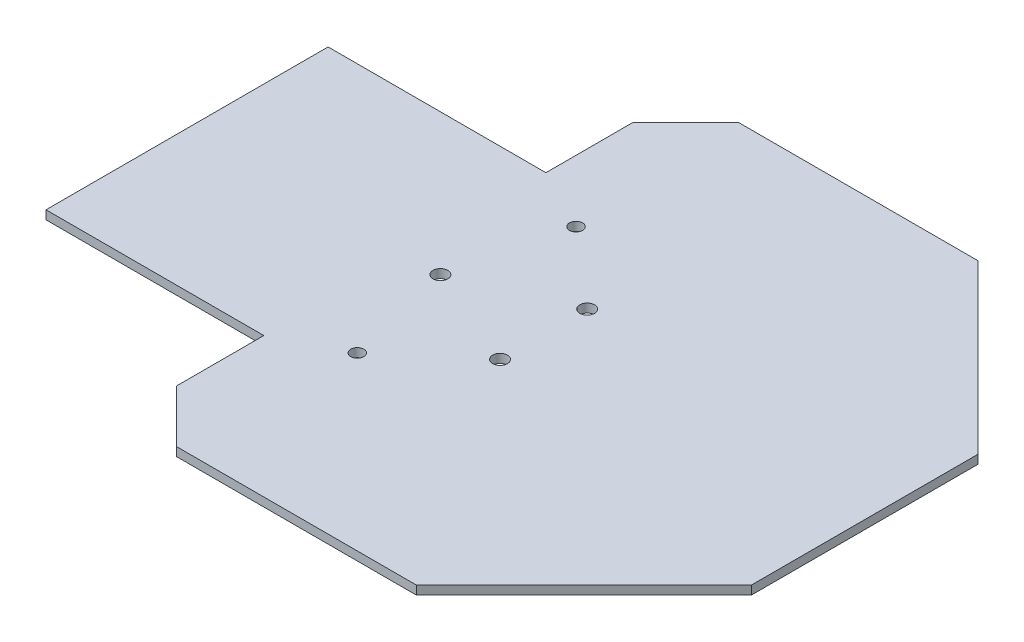
ISO-10303-21;
HEADER;
FILE_DESCRIPTION(('STEP AP214'),'2;1');
FILE_NAME('part.step','',(''),(''),'','','');
FILE_SCHEMA(('AUTOMOTIVE_DESIGN { 1 0 10303 214 1 1 1 1 }'));
ENDSEC;
DATA;
#1=APPLICATION_CONTEXT('core data for automotive mechanical design processes');
#2=APPLICATION_PROTOCOL_DEFINITION('international standard','automotive_design',2000,#1);
#3=PRODUCT_CONTEXT('',#1,'mechanical');
#4=PRODUCT('Part','Part','',(#3));
#5=PRODUCT_RELATED_PRODUCT_CATEGORY('part','',(#4));
#6=PRODUCT_DEFINITION_FORMATION('','',#4);
#7=PRODUCT_DEFINITION_CONTEXT('part definition',#1,'design');
#8=PRODUCT_DEFINITION('design','',#6,#7);
#9=PRODUCT_DEFINITION_SHAPE('','',#8);
#10=(LENGTH_UNIT() NAMED_UNIT(*) SI_UNIT(.MILLI.,.METRE.));
#11=(NAMED_UNIT(*) PLANE_ANGLE_UNIT() SI_UNIT($,.RADIAN.));
#12=(NAMED_UNIT(*) SI_UNIT($,.STERADIAN.) SOLID_ANGLE_UNIT());
#13=UNCERTAINTY_MEASURE_WITH_UNIT(LENGTH_MEASURE(1.E-05),#10,'distance_accuracy_value','');
#14=(GEOMETRIC_REPRESENTATION_CONTEXT(3) GLOBAL_UNCERTAINTY_ASSIGNED_CONTEXT((#13)) GLOBAL_UNIT_ASSIGNED_CONTEXT((#10,
#11,#12)) REPRESENTATION_CONTEXT('',''));
#15=CARTESIAN_POINT('',(0.,0.,0.));
#16=DIRECTION('',(0.,0.,1.));
#17=DIRECTION('',(1.,0.,0.));
#18=AXIS2_PLACEMENT_3D('',#15,#16,#17);
#19=CARTESIAN_POINT('',(0.,2.,-12.09));
#20=DIRECTION('',(1.,0.,0.));
#21=DIRECTION('',(0.,0.,-1.));
#22=AXIS2_PLACEMENT_3D('',#19,#20,#21);
#23=PLANE('',#22);
#24=DIRECTION('',(0.,-1.,0.));
#25=VECTOR('',#24,1.);
#26=CARTESIAN_POINT('',(0.,2.,-96.84));
#27=LINE('',#26,#25);
#28=CARTESIAN_POINT('',(0.,2.,-96.84));
#29=VERTEX_POINT('',#28);
#30=CARTESIAN_POINT('',(0.,0.,-96.84));
#31=VERTEX_POINT('',#30);
#32=EDGE_CURVE('E63',#29,#31,#27,.T.);
#33=ORIENTED_EDGE('',*,*,#32,.F.);
#34=DIRECTION('',(0.,0.,1.));
#35=VECTOR('',#34,1.);
#36=CARTESIAN_POINT('',(0.,2.,-12.09));
#37=LINE('',#36,#35);
#38=CARTESIAN_POINT('',(0.,2.,-116.84));
#39=VERTEX_POINT('',#38);
#40=EDGE_CURVE('E223',#39,#29,#37,.T.);
#41=ORIENTED_EDGE('',*,*,#40,.F.);
#42=DIRECTION('',(0.,-1.,0.));
#43=VECTOR('',#42,1.);
#44=CARTESIAN_POINT('',(0.,2.,-116.84));
#45=LINE('',#44,#43);
#46=CARTESIAN_POINT('',(0.,0.,-116.84));
#47=VERTEX_POINT('',#46);
#48=EDGE_CURVE('E282',#39,#47,#45,.T.);
#49=ORIENTED_EDGE('',*,*,#48,.T.);
#50=DIRECTION('',(0.,0.,1.));
#51=VECTOR('',#50,1.);
#52=CARTESIAN_POINT('',(0.,0.,-12.09));
#53=LINE('',#52,#51);
#54=EDGE_CURVE('E249',#47,#31,#53,.T.);
#55=ORIENTED_EDGE('',*,*,#54,.T.);
#56=EDGE_LOOP('',(#33,#41,#49,#55));
#57=FACE_BOUND('',#56,.T.);
#58=ADVANCED_FACE('F47',(#57),#23,.F.);
#59=DIRECTION('',(0.,1.,0.));
#60=VECTOR('',#59,1.);
#61=CARTESIAN_POINT('',(0.,2.,-32.09));
#62=LINE('',#61,#60);
#63=CARTESIAN_POINT('',(0.,0.,-32.09));
#64=VERTEX_POINT('',#63);
#65=CARTESIAN_POINT('',(0.,2.,-32.09));
#66=VERTEX_POINT('',#65);
#67=EDGE_CURVE('E71',#64,#66,#62,.T.);
#68=ORIENTED_EDGE('',*,*,#67,.F.);
#69=CARTESIAN_POINT('',(0.,0.,-12.09));
#70=VERTEX_POINT('',#69);
#71=EDGE_CURVE('E248',#64,#70,#53,.T.);
#72=ORIENTED_EDGE('',*,*,#71,.T.);
#73=DIRECTION('',(0.,-1.,0.));
#74=VECTOR('',#73,1.);
#75=CARTESIAN_POINT('',(0.,2.,-12.09));
#76=LINE('',#75,#74);
#77=CARTESIAN_POINT('',(0.,2.,-12.09));
#78=VERTEX_POINT('',#77);
#79=EDGE_CURVE('E278',#78,#70,#76,.T.);
#80=ORIENTED_EDGE('',*,*,#79,.F.);
#81=EDGE_CURVE('E222',#66,#78,#37,.T.);
#82=ORIENTED_EDGE('',*,*,#81,.F.);
#83=EDGE_LOOP('',(#68,#72,#80,#82));
#84=FACE_BOUND('',#83,.T.);
#85=ADVANCED_FACE('F316',(#84),#23,.F.);
#86=CARTESIAN_POINT('',(67.09,2.,-128.93));
#87=DIRECTION('',(-0.707152737497725,0.,0.707060821888381));
#88=DIRECTION('',(0.707060821888381,0.,0.707152737497725));
#89=AXIS2_PLACEMENT_3D('',#86,#87,#88);
#90=PLANE('',#89);
#91=DIRECTION('',(-0.707060821888381,0.,-0.707152737497725));
#92=VECTOR('',#91,1.);
#93=CARTESIAN_POINT('',(67.09,0.,-128.93));
#94=LINE('',#93,#92);
#95=CARTESIAN_POINT('',(105.554999675029,0.,-90.46));
#96=VERTEX_POINT('',#95);
#97=CARTESIAN_POINT('',(67.09,0.,-128.93));
#98=VERTEX_POINT('',#97);
#99=EDGE_CURVE('E191',#96,#98,#94,.T.);
#100=ORIENTED_EDGE('',*,*,#99,.T.);
#101=DIRECTION('',(0.,-1.,0.));
#102=VECTOR('',#101,1.);
#103=CARTESIAN_POINT('',(67.09,2.,-128.93));
#104=LINE('',#103,#102);
#105=CARTESIAN_POINT('',(67.09,2.,-128.93));
#106=VERTEX_POINT('',#105);
#107=EDGE_CURVE('E11',#106,#98,#104,.T.);
#108=ORIENTED_EDGE('',*,*,#107,.F.);
#109=DIRECTION('',(-0.707060821888381,0.,-0.707152737497725));
#110=VECTOR('',#109,1.);
#111=CARTESIAN_POINT('',(67.09,2.,-128.93));
#112=LINE('',#111,#110);
#113=CARTESIAN_POINT('',(105.554999675029,2.,-90.46));
#114=VERTEX_POINT('',#113);
#115=EDGE_CURVE('E211',#114,#106,#112,.T.);
#116=ORIENTED_EDGE('',*,*,#115,.F.);
#117=DIRECTION('',(0.,-1.,0.));
#118=VECTOR('',#117,1.);
#119=CARTESIAN_POINT('',(105.554999675029,2.,-90.46));
#120=LINE('',#119,#118);
#121=EDGE_CURVE('E238',#114,#96,#120,.T.);
#122=ORIENTED_EDGE('',*,*,#121,.T.);
#123=EDGE_LOOP('',(#100,#108,#116,#122));
#124=FACE_BOUND('',#123,.T.);
#125=ADVANCED_FACE('F49',(#124),#90,.F.);
#126=CARTESIAN_POINT('',(12.09,2.,-128.93));
#127=DIRECTION('',(0.,0.,1.));
#128=DIRECTION('',(1.,0.,0.));
#129=AXIS2_PLACEMENT_3D('',#126,#127,#128);
#130=PLANE('',#129);
#131=DIRECTION('',(-1.,0.,0.));
#132=VECTOR('',#131,1.);
#133=CARTESIAN_POINT('',(12.09,0.,-128.93));
#134=LINE('',#133,#132);
#135=CARTESIAN_POINT('',(12.09,0.,-128.93));
#136=VERTEX_POINT('',#135);
#137=EDGE_CURVE('E242',#98,#136,#134,.T.);
#138=ORIENTED_EDGE('',*,*,#137,.T.);
#139=DIRECTION('',(0.,-1.,0.));
#140=VECTOR('',#139,1.);
#141=CARTESIAN_POINT('',(12.09,2.,-128.93));
#142=LINE('',#141,#140);
#143=CARTESIAN_POINT('',(12.09,2.,-128.93));
#144=VERTEX_POINT('',#143);
#145=EDGE_CURVE('E56',#144,#136,#142,.T.);
#146=ORIENTED_EDGE('',*,*,#145,.F.);
#147=DIRECTION('',(-1.,0.,0.));
#148=VECTOR('',#147,1.);
#149=CARTESIAN_POINT('',(12.09,2.,-128.93));
#150=LINE('',#149,#148);
#151=EDGE_CURVE('E215',#106,#144,#150,.T.);
#152=ORIENTED_EDGE('',*,*,#151,.F.);
#153=ORIENTED_EDGE('',*,*,#107,.T.);
#154=EDGE_LOOP('',(#138,#146,#152,#153));
#155=FACE_BOUND('',#154,.T.);
#156=ADVANCED_FACE('F338',(#155),#130,.F.);
#157=CARTESIAN_POINT('',(0.,2.,-116.84));
#158=DIRECTION('',(0.707106781186548,0.,0.707106781186547));
#159=DIRECTION('',(0.707106781186547,0.,-0.707106781186548));
#160=AXIS2_PLACEMENT_3D('',#157,#158,#159);
#161=PLANE('',#160);
#162=DIRECTION('',(-0.707106781186547,0.,0.707106781186548));
#163=VECTOR('',#162,1.);
#164=CARTESIAN_POINT('',(0.,0.,-116.84));
#165=LINE('',#164,#163);
#166=EDGE_CURVE('E245',#136,#47,#165,.T.);
#167=ORIENTED_EDGE('',*,*,#166,.T.);
#168=ORIENTED_EDGE('',*,*,#48,.F.);
#169=DIRECTION('',(-0.707106781186547,0.,0.707106781186548));
#170=VECTOR('',#169,1.);
#171=CARTESIAN_POINT('',(0.,2.,-116.84));
#172=LINE('',#171,#170);
#173=EDGE_CURVE('E219',#144,#39,#172,.T.);
#174=ORIENTED_EDGE('',*,*,#173,.F.);
#175=ORIENTED_EDGE('',*,*,#145,.T.);
#176=EDGE_LOOP('',(#167,#168,#174,#175));
#177=FACE_BOUND('',#176,.T.);
#178=ADVANCED_FACE('F291',(#177),#161,.F.);
#179=CARTESIAN_POINT('',(12.09,2.,0.));
#180=DIRECTION('',(0.707106781186547,0.,-0.707106781186547));
#181=DIRECTION('',(-0.707106781186548,0.,-0.707106781186548));
#182=AXIS2_PLACEMENT_3D('',#179,#180,#181);
#183=PLANE('',#182);
#184=DIRECTION('',(0.707106781186547,0.,0.707106781186547));
#185=VECTOR('',#184,1.);
#186=CARTESIAN_POINT('',(12.09,0.,0.));
#187=LINE('',#186,#185);
#188=CARTESIAN_POINT('',(12.09,0.,0.));
#189=VERTEX_POINT('',#188);
#190=EDGE_CURVE('E252',#70,#189,#187,.T.);
#191=ORIENTED_EDGE('',*,*,#190,.T.);
#192=DIRECTION('',(0.,-1.,0.));
#193=VECTOR('',#192,1.);
#194=CARTESIAN_POINT('',(12.09,2.,0.));
#195=LINE('',#194,#193);
#196=CARTESIAN_POINT('',(12.09,2.,0.));
#197=VERTEX_POINT('',#196);
#198=EDGE_CURVE('E274',#197,#189,#195,.T.);
#199=ORIENTED_EDGE('',*,*,#198,.F.);
#200=DIRECTION('',(0.707106781186547,0.,0.707106781186547));
#201=VECTOR('',#200,1.);
#202=CARTESIAN_POINT('',(12.09,2.,0.));
#203=LINE('',#202,#201);
#204=EDGE_CURVE('E226',#78,#197,#203,.T.);
#205=ORIENTED_EDGE('',*,*,#204,.F.);
#206=ORIENTED_EDGE('',*,*,#79,.T.);
#207=EDGE_LOOP('',(#191,#199,#205,#206));
#208=FACE_BOUND('',#207,.T.);
#209=ADVANCED_FACE('F319',(#208),#183,.F.);
#210=CARTESIAN_POINT('',(67.09,2.,0.));
#211=DIRECTION('',(0.,0.,-1.));
#212=DIRECTION('',(-1.,0.,0.));
#213=AXIS2_PLACEMENT_3D('',#210,#211,#212);
#214=PLANE('',#213);
#215=DIRECTION('',(1.,0.,0.));
#216=VECTOR('',#215,1.);
#217=CARTESIAN_POINT('',(67.09,0.,0.));
#218=LINE('',#217,#216);
#219=CARTESIAN_POINT('',(67.09,0.,0.));
#220=VERTEX_POINT('',#219);
#221=EDGE_CURVE('E255',#189,#220,#218,.T.);
#222=ORIENTED_EDGE('',*,*,#221,.T.);
#223=DIRECTION('',(0.,-1.,0.));
#224=VECTOR('',#223,1.);
#225=CARTESIAN_POINT('',(67.09,2.,0.));
#226=LINE('',#225,#224);
#227=CARTESIAN_POINT('',(67.09,2.,0.));
#228=VERTEX_POINT('',#227);
#229=EDGE_CURVE('E270',#228,#220,#226,.T.);
#230=ORIENTED_EDGE('',*,*,#229,.F.);
#231=DIRECTION('',(1.,0.,0.));
#232=VECTOR('',#231,1.);
#233=CARTESIAN_POINT('',(67.09,2.,0.));
#234=LINE('',#233,#232);
#235=EDGE_CURVE('E229',#197,#228,#234,.T.);
#236=ORIENTED_EDGE('',*,*,#235,.F.);
#237=ORIENTED_EDGE('',*,*,#198,.T.);
#238=EDGE_LOOP('',(#222,#230,#236,#237));
#239=FACE_BOUND('',#238,.T.);
#240=ADVANCED_FACE('F324',(#239),#214,.F.);
#241=CARTESIAN_POINT('',(105.554999675029,2.,-38.46));
#242=DIRECTION('',(-0.707060821888382,0.,-0.707152737497725));
#243=DIRECTION('',(-0.707152737497725,0.,0.707060821888382));
#244=AXIS2_PLACEMENT_3D('',#241,#242,#243);
#245=PLANE('',#244);
#246=DIRECTION('',(0.707152737497725,0.,-0.707060821888382));
#247=VECTOR('',#246,1.);
#248=CARTESIAN_POINT('',(105.554999675029,0.,-38.46));
#249=LINE('',#248,#247);
#250=CARTESIAN_POINT('',(105.554999675029,0.,-38.46));
#251=VERTEX_POINT('',#250);
#252=EDGE_CURVE('E258',#220,#251,#249,.T.);
#253=ORIENTED_EDGE('',*,*,#252,.T.);
#254=DIRECTION('',(0.,-1.,0.));
#255=VECTOR('',#254,1.);
#256=CARTESIAN_POINT('',(105.554999675029,2.,-38.46));
#257=LINE('',#256,#255);
#258=CARTESIAN_POINT('',(105.554999675029,2.,-38.46));
#259=VERTEX_POINT('',#258);
#260=EDGE_CURVE('E266',#259,#251,#257,.T.);
#261=ORIENTED_EDGE('',*,*,#260,.F.);
#262=DIRECTION('',(0.707152737497725,0.,-0.707060821888382));
#263=VECTOR('',#262,1.);
#264=CARTESIAN_POINT('',(105.554999675029,2.,-38.46));
#265=LINE('',#264,#263);
#266=EDGE_CURVE('E232',#228,#259,#265,.T.);
#267=ORIENTED_EDGE('',*,*,#266,.F.);
#268=ORIENTED_EDGE('',*,*,#229,.T.);
#269=EDGE_LOOP('',(#253,#261,#267,#268));
#270=FACE_BOUND('',#269,.T.);
#271=ADVANCED_FACE('F330',(#270),#245,.F.);
#272=CARTESIAN_POINT('',(105.554999675029,2.,-90.46));
#273=DIRECTION('',(-1.,0.,0.));
#274=DIRECTION('',(0.,0.,1.));
#275=AXIS2_PLACEMENT_3D('',#272,#273,#274);
#276=PLANE('',#275);
#277=DIRECTION('',(0.,0.,-1.));
#278=VECTOR('',#277,1.);
#279=CARTESIAN_POINT('',(105.554999675029,0.,-90.46));
#280=LINE('',#279,#278);
#281=EDGE_CURVE('E216',#251,#96,#280,.T.);
#282=ORIENTED_EDGE('',*,*,#281,.T.);
#283=ORIENTED_EDGE('',*,*,#121,.F.);
#284=DIRECTION('',(0.,0.,-1.));
#285=VECTOR('',#284,1.);
#286=CARTESIAN_POINT('',(105.554999675029,2.,-90.46));
#287=LINE('',#286,#285);
#288=EDGE_CURVE('E235',#259,#114,#287,.T.);
#289=ORIENTED_EDGE('',*,*,#288,.F.);
#290=ORIENTED_EDGE('',*,*,#260,.T.);
#291=EDGE_LOOP('',(#282,#283,#289,#290));
#292=FACE_BOUND('',#291,.T.);
#293=ADVANCED_FACE('F334',(#292),#276,.F.);
#294=CARTESIAN_POINT('',(0.,2.,0.));
#295=DIRECTION('',(0.,-1.,0.));
#296=DIRECTION('',(0.,0.,-1.));
#297=AXIS2_PLACEMENT_3D('',#294,#295,#296);
#298=PLANE('',#297);
#299=CARTESIAN_POINT('',(14.18,2.,-89.57));
#300=DIRECTION('',(0.,1.,0.));
#301=DIRECTION('',(0.,0.,1.));
#302=AXIS2_PLACEMENT_3D('',#299,#300,#301);
#303=CIRCLE('',#302,1.5);
#304=CARTESIAN_POINT('',(14.18,2.,-88.07));
#305=VERTEX_POINT('',#304);
#306=EDGE_CURVE('E175',#305,#305,#303,.T.);
#307=ORIENTED_EDGE('',*,*,#306,.F.);
#308=EDGE_LOOP('',(#307));
#309=FACE_BOUND('',#308,.T.);
#310=CARTESIAN_POINT('',(14.1776215554253,2.,-39.3586567371682));
#311=DIRECTION('',(0.,1.,0.));
#312=DIRECTION('',(0.,0.,-1.));
#313=AXIS2_PLACEMENT_3D('',#310,#311,#312);
#314=CIRCLE('',#313,1.49999999999998);
#315=CARTESIAN_POINT('',(14.1776215554253,2.,-40.8586567371681));
#316=VERTEX_POINT('',#315);
#317=EDGE_CURVE('E164',#316,#316,#314,.T.);
#318=ORIENTED_EDGE('',*,*,#317,.F.);
#319=EDGE_LOOP('',(#318));
#320=FACE_BOUND('',#319,.T.);
#321=CARTESIAN_POINT('',(8.15000000000004,2.,-64.465));
#322=DIRECTION('',(0.,1.,0.));
#323=DIRECTION('',(0.,0.,1.));
#324=AXIS2_PLACEMENT_3D('',#321,#322,#323);
#325=CIRCLE('',#324,1.69999999999999);
#326=CARTESIAN_POINT('',(8.15000000000004,2.,-62.765));
#327=VERTEX_POINT('',#326);
#328=EDGE_CURVE('E192',#327,#327,#325,.T.);
#329=ORIENTED_EDGE('',*,*,#328,.F.);
#330=EDGE_LOOP('',(#329));
#331=FACE_BOUND('',#330,.T.);
#332=CARTESIAN_POINT('',(31.85,2.,-54.465));
#333=DIRECTION('',(0.,1.,0.));
#334=DIRECTION('',(0.,0.,1.));
#335=AXIS2_PLACEMENT_3D('',#332,#333,#334);
#336=CIRCLE('',#335,1.7);
#337=CARTESIAN_POINT('',(31.85,2.,-52.765));
#338=VERTEX_POINT('',#337);
#339=EDGE_CURVE('E196',#338,#338,#336,.T.);
#340=ORIENTED_EDGE('',*,*,#339,.F.);
#341=EDGE_LOOP('',(#340));
#342=FACE_BOUND('',#341,.T.);
#343=CARTESIAN_POINT('',(31.85,2.,-74.465));
#344=DIRECTION('',(0.,1.,0.));
#345=DIRECTION('',(0.,0.,1.));
#346=AXIS2_PLACEMENT_3D('',#343,#344,#345);
#347=CIRCLE('',#346,1.69999999999999);
#348=CARTESIAN_POINT('',(31.85,2.,-72.765));
#349=VERTEX_POINT('',#348);
#350=EDGE_CURVE('E204',#349,#349,#347,.T.);
#351=ORIENTED_EDGE('',*,*,#350,.F.);
#352=EDGE_LOOP('',(#351));
#353=FACE_BOUND('',#352,.T.);
#354=ORIENTED_EDGE('',*,*,#115,.T.);
#355=ORIENTED_EDGE('',*,*,#151,.T.);
#356=ORIENTED_EDGE('',*,*,#173,.T.);
#357=ORIENTED_EDGE('',*,*,#40,.T.);
#358=DIRECTION('',(1.,0.,0.));
#359=VECTOR('',#358,1.);
#360=CARTESIAN_POINT('',(-50.,2.,-96.84));
#361=LINE('',#360,#359);
#362=CARTESIAN_POINT('',(-50.,2.,-96.84));
#363=VERTEX_POINT('',#362);
#364=EDGE_CURVE('E296',#363,#29,#361,.T.);
#365=ORIENTED_EDGE('',*,*,#364,.F.);
#366=DIRECTION('',(0.,0.,-1.));
#367=VECTOR('',#366,1.);
#368=CARTESIAN_POINT('',(-50.,2.,-96.84));
#369=LINE('',#368,#367);
#370=CARTESIAN_POINT('',(-50.,2.,-32.09));
#371=VERTEX_POINT('',#370);
#372=EDGE_CURVE('E156',#371,#363,#369,.T.);
#373=ORIENTED_EDGE('',*,*,#372,.F.);
#374=DIRECTION('',(1.,0.,0.));
#375=VECTOR('',#374,1.);
#376=CARTESIAN_POINT('',(-50.,2.,-32.09));
#377=LINE('',#376,#375);
#378=EDGE_CURVE('E171',#371,#66,#377,.T.);
#379=ORIENTED_EDGE('',*,*,#378,.T.);
#380=ORIENTED_EDGE('',*,*,#81,.T.);
#381=ORIENTED_EDGE('',*,*,#204,.T.);
#382=ORIENTED_EDGE('',*,*,#235,.T.);
#383=ORIENTED_EDGE('',*,*,#266,.T.);
#384=ORIENTED_EDGE('',*,*,#288,.T.);
#385=EDGE_LOOP('',(#354,#355,#356,#357,#365,#373,#379,#380,#381,#382,#383,#384));
#386=FACE_BOUND('',#385,.T.);
#387=ADVANCED_FACE('F295',(#309,#320,#331,#342,#353,#386),#298,.F.);
#388=CARTESIAN_POINT('',(0.,0.,0.));
#389=DIRECTION('',(0.,-1.,0.));
#390=DIRECTION('',(0.,0.,-1.));
#391=AXIS2_PLACEMENT_3D('',#388,#389,#390);
#392=PLANE('',#391);
#393=CARTESIAN_POINT('',(14.18,0.,-89.57));
#394=DIRECTION('',(0.,-1.,0.));
#395=DIRECTION('',(0.,0.,-1.));
#396=AXIS2_PLACEMENT_3D('',#393,#394,#395);
#397=CIRCLE('',#396,1.5);
#398=CARTESIAN_POINT('',(14.18,0.,-91.07));
#399=VERTEX_POINT('',#398);
#400=EDGE_CURVE('E180',#399,#399,#397,.F.);
#401=ORIENTED_EDGE('',*,*,#400,.T.);
#402=EDGE_LOOP('',(#401));
#403=FACE_BOUND('',#402,.T.);
#404=CARTESIAN_POINT('',(14.1776215554253,0.,-39.3586567371682));
#405=DIRECTION('',(0.,-1.,0.));
#406=DIRECTION('',(0.,0.,-1.));
#407=AXIS2_PLACEMENT_3D('',#404,#405,#406);
#408=CIRCLE('',#407,1.49999999999998);
#409=CARTESIAN_POINT('',(14.1776215554253,0.,-40.8586567371681));
#410=VERTEX_POINT('',#409);
#411=EDGE_CURVE('E169',#410,#410,#408,.F.);
#412=ORIENTED_EDGE('',*,*,#411,.T.);
#413=EDGE_LOOP('',(#412));
#414=FACE_BOUND('',#413,.T.);
#415=CARTESIAN_POINT('',(8.15000000000004,0.,-64.465));
#416=DIRECTION('',(0.,1.,0.));
#417=DIRECTION('',(0.,0.,1.));
#418=AXIS2_PLACEMENT_3D('',#415,#416,#417);
#419=CIRCLE('',#418,1.69999999999999);
#420=CARTESIAN_POINT('',(8.15000000000004,0.,-62.765));
#421=VERTEX_POINT('',#420);
#422=EDGE_CURVE('E187',#421,#421,#419,.T.);
#423=ORIENTED_EDGE('',*,*,#422,.T.);
#424=EDGE_LOOP('',(#423));
#425=FACE_BOUND('',#424,.T.);
#426=CARTESIAN_POINT('',(31.85,0.,-54.465));
#427=DIRECTION('',(0.,1.,0.));
#428=DIRECTION('',(0.,0.,1.));
#429=AXIS2_PLACEMENT_3D('',#426,#427,#428);
#430=CIRCLE('',#429,1.7);
#431=CARTESIAN_POINT('',(31.85,0.,-52.765));
#432=VERTEX_POINT('',#431);
#433=EDGE_CURVE('E200',#432,#432,#430,.T.);
#434=ORIENTED_EDGE('',*,*,#433,.T.);
#435=EDGE_LOOP('',(#434));
#436=FACE_BOUND('',#435,.T.);
#437=CARTESIAN_POINT('',(31.85,0.,-74.465));
#438=DIRECTION('',(0.,1.,0.));
#439=DIRECTION('',(0.,0.,1.));
#440=AXIS2_PLACEMENT_3D('',#437,#438,#439);
#441=CIRCLE('',#440,1.69999999999999);
#442=CARTESIAN_POINT('',(31.85,0.,-72.765));
#443=VERTEX_POINT('',#442);
#444=EDGE_CURVE('E179',#443,#443,#441,.T.);
#445=ORIENTED_EDGE('',*,*,#444,.T.);
#446=EDGE_LOOP('',(#445));
#447=FACE_BOUND('',#446,.T.);
#448=ORIENTED_EDGE('',*,*,#99,.F.);
#449=ORIENTED_EDGE('',*,*,#281,.F.);
#450=ORIENTED_EDGE('',*,*,#252,.F.);
#451=ORIENTED_EDGE('',*,*,#221,.F.);
#452=ORIENTED_EDGE('',*,*,#190,.F.);
#453=ORIENTED_EDGE('',*,*,#71,.F.);
#454=DIRECTION('',(1.,0.,0.));
#455=VECTOR('',#454,1.);
#456=CARTESIAN_POINT('',(-50.,0.,-32.09));
#457=LINE('',#456,#455);
#458=CARTESIAN_POINT('',(-50.,0.,-32.09));
#459=VERTEX_POINT('',#458);
#460=EDGE_CURVE('E146',#459,#64,#457,.T.);
#461=ORIENTED_EDGE('',*,*,#460,.F.);
#462=DIRECTION('',(0.,0.,1.));
#463=VECTOR('',#462,1.);
#464=CARTESIAN_POINT('',(-50.,0.,-96.84));
#465=LINE('',#464,#463);
#466=CARTESIAN_POINT('',(-50.,0.,-96.84));
#467=VERTEX_POINT('',#466);
#468=EDGE_CURVE('E138',#467,#459,#465,.T.);
#469=ORIENTED_EDGE('',*,*,#468,.F.);
#470=DIRECTION('',(1.,0.,0.));
#471=VECTOR('',#470,1.);
#472=CARTESIAN_POINT('',(-50.,0.,-96.84));
#473=LINE('',#472,#471);
#474=EDGE_CURVE('E144',#467,#31,#473,.T.);
#475=ORIENTED_EDGE('',*,*,#474,.T.);
#476=ORIENTED_EDGE('',*,*,#54,.F.);
#477=ORIENTED_EDGE('',*,*,#166,.F.);
#478=ORIENTED_EDGE('',*,*,#137,.F.);
#479=EDGE_LOOP('',(#448,#449,#450,#451,#452,#453,#461,#469,#475,#476,#477,#478));
#480=FACE_BOUND('',#479,.T.);
#481=ADVANCED_FACE('F141',(#403,#414,#425,#436,#447,#480),#392,.T.);
#482=CARTESIAN_POINT('',(31.85,0.,-74.465));
#483=DIRECTION('',(0.,1.,0.));
#484=DIRECTION('',(0.,0.,1.));
#485=AXIS2_PLACEMENT_3D('',#482,#483,#484);
#486=CYLINDRICAL_SURFACE('',#485,1.69999999999999);
#487=ORIENTED_EDGE('',*,*,#444,.F.);
#488=EDGE_LOOP('',(#487));
#489=FACE_BOUND('',#488,.T.);
#490=ORIENTED_EDGE('',*,*,#350,.T.);
#491=EDGE_LOOP('',(#490));
#492=FACE_BOUND('',#491,.T.);
#493=ADVANCED_FACE('F363',(#489,#492),#486,.F.);
#494=CARTESIAN_POINT('',(31.85,0.,-54.465));
#495=DIRECTION('',(0.,1.,0.));
#496=DIRECTION('',(0.,0.,1.));
#497=AXIS2_PLACEMENT_3D('',#494,#495,#496);
#498=CYLINDRICAL_SURFACE('',#497,1.7);
#499=ORIENTED_EDGE('',*,*,#433,.F.);
#500=EDGE_LOOP('',(#499));
#501=FACE_BOUND('',#500,.T.);
#502=ORIENTED_EDGE('',*,*,#339,.T.);
#503=EDGE_LOOP('',(#502));
#504=FACE_BOUND('',#503,.T.);
#505=ADVANCED_FACE('F370',(#501,#504),#498,.F.);
#506=CARTESIAN_POINT('',(8.15000000000004,0.,-64.465));
#507=DIRECTION('',(0.,1.,0.));
#508=DIRECTION('',(0.,0.,1.));
#509=AXIS2_PLACEMENT_3D('',#506,#507,#508);
#510=CYLINDRICAL_SURFACE('',#509,1.69999999999999);
#511=ORIENTED_EDGE('',*,*,#422,.F.);
#512=EDGE_LOOP('',(#511));
#513=FACE_BOUND('',#512,.T.);
#514=ORIENTED_EDGE('',*,*,#328,.T.);
#515=EDGE_LOOP('',(#514));
#516=FACE_BOUND('',#515,.T.);
#517=ADVANCED_FACE('F374',(#513,#516),#510,.F.);
#518=CARTESIAN_POINT('',(14.1776215554253,-0.00100000000000013,-39.3586567371682));
#519=DIRECTION('',(0.,1.,0.));
#520=DIRECTION('',(0.,0.,1.));
#521=AXIS2_PLACEMENT_3D('',#518,#519,#520);
#522=CYLINDRICAL_SURFACE('',#521,1.49999999999998);
#523=ORIENTED_EDGE('',*,*,#411,.F.);
#524=EDGE_LOOP('',(#523));
#525=FACE_BOUND('',#524,.T.);
#526=ORIENTED_EDGE('',*,*,#317,.T.);
#527=EDGE_LOOP('',(#526));
#528=FACE_BOUND('',#527,.T.);
#529=ADVANCED_FACE('F378',(#525,#528),#522,.F.);
#530=CARTESIAN_POINT('',(14.18,-0.00100000000000013,-89.57));
#531=DIRECTION('',(0.,1.,0.));
#532=DIRECTION('',(0.,0.,1.));
#533=AXIS2_PLACEMENT_3D('',#530,#531,#532);
#534=CYLINDRICAL_SURFACE('',#533,1.5);
#535=ORIENTED_EDGE('',*,*,#400,.F.);
#536=EDGE_LOOP('',(#535));
#537=FACE_BOUND('',#536,.T.);
#538=ORIENTED_EDGE('',*,*,#306,.T.);
#539=EDGE_LOOP('',(#538));
#540=FACE_BOUND('',#539,.T.);
#541=ADVANCED_FACE('F382',(#537,#540),#534,.F.);
#542=CARTESIAN_POINT('',(-50.,2.,-96.84));
#543=DIRECTION('',(0.,0.,1.));
#544=DIRECTION('',(1.,0.,0.));
#545=AXIS2_PLACEMENT_3D('',#542,#543,#544);
#546=PLANE('',#545);
#547=ORIENTED_EDGE('',*,*,#32,.T.);
#548=ORIENTED_EDGE('',*,*,#474,.F.);
#549=DIRECTION('',(0.,-1.,0.));
#550=VECTOR('',#549,1.);
#551=CARTESIAN_POINT('',(-50.,2.,-96.84));
#552=LINE('',#551,#550);
#553=EDGE_CURVE('E151',#363,#467,#552,.T.);
#554=ORIENTED_EDGE('',*,*,#553,.F.);
#555=ORIENTED_EDGE('',*,*,#364,.T.);
#556=EDGE_LOOP('',(#547,#548,#554,#555));
#557=FACE_BOUND('',#556,.T.);
#558=ADVANCED_FACE('F162',(#557),#546,.F.);
#559=CARTESIAN_POINT('',(-50.,2.,-32.09));
#560=DIRECTION('',(0.,0.,-1.));
#561=DIRECTION('',(-1.,0.,0.));
#562=AXIS2_PLACEMENT_3D('',#559,#560,#561);
#563=PLANE('',#562);
#564=ORIENTED_EDGE('',*,*,#67,.T.);
#565=ORIENTED_EDGE('',*,*,#378,.F.);
#566=DIRECTION('',(0.,1.,0.));
#567=VECTOR('',#566,1.);
#568=CARTESIAN_POINT('',(-50.,2.,-32.09));
#569=LINE('',#568,#567);
#570=EDGE_CURVE('E150',#459,#371,#569,.T.);
#571=ORIENTED_EDGE('',*,*,#570,.F.);
#572=ORIENTED_EDGE('',*,*,#460,.T.);
#573=EDGE_LOOP('',(#564,#565,#571,#572));
#574=FACE_BOUND('',#573,.T.);
#575=ADVANCED_FACE('F311',(#574),#563,.F.);
#576=CARTESIAN_POINT('',(-50.,0.,0.));
#577=DIRECTION('',(-1.,0.,0.));
#578=DIRECTION('',(0.,0.,1.));
#579=AXIS2_PLACEMENT_3D('',#576,#577,#578);
#580=PLANE('',#579);
#581=ORIENTED_EDGE('',*,*,#553,.T.);
#582=ORIENTED_EDGE('',*,*,#468,.T.);
#583=ORIENTED_EDGE('',*,*,#570,.T.);
#584=ORIENTED_EDGE('',*,*,#372,.T.);
#585=EDGE_LOOP('',(#581,#582,#583,#584));
#586=FACE_BOUND('',#585,.T.);
#587=ADVANCED_FACE('F154',(#586),#580,.T.);
#588=CLOSED_SHELL('',(#58,#85,#125,#156,#178,#209,#240,#271,#293,#387,#481,#493,#505,#517,#529,
#541,#558,#575,#587));
#589=MANIFOLD_SOLID_BREP('B2',#588);
#590=ADVANCED_BREP_SHAPE_REPRESENTATION('',(#18,#589),#14);
#591=SHAPE_DEFINITION_REPRESENTATION(#9,#590);
ENDSEC;
END-ISO-10303-21;
